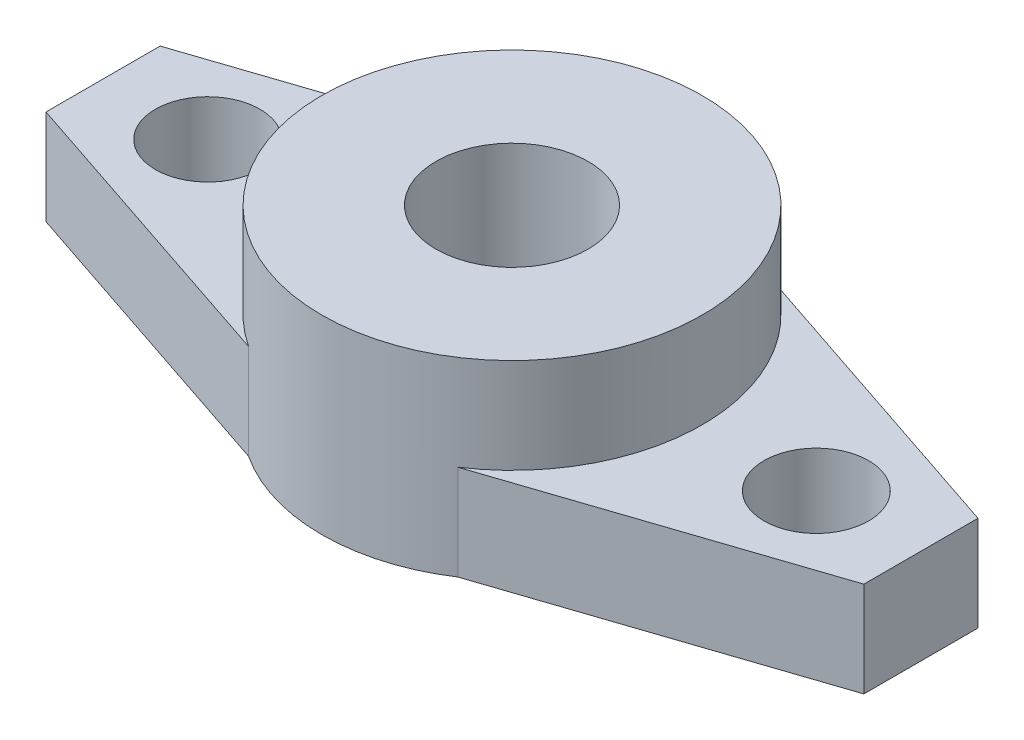
ISO-10303-21;
HEADER;
FILE_DESCRIPTION(('STEP AP214'),'2;1');
FILE_NAME('part.step','',(''),(''),'','','');
FILE_SCHEMA(('AUTOMOTIVE_DESIGN { 1 0 10303 214 1 1 1 1 }'));
ENDSEC;
DATA;
#1=APPLICATION_CONTEXT('core data for automotive mechanical design processes');
#2=APPLICATION_PROTOCOL_DEFINITION('international standard','automotive_design',2000,#1);
#3=PRODUCT_CONTEXT('',#1,'mechanical');
#4=PRODUCT('Part','Part','',(#3));
#5=PRODUCT_RELATED_PRODUCT_CATEGORY('part','',(#4));
#6=PRODUCT_DEFINITION_FORMATION('','',#4);
#7=PRODUCT_DEFINITION_CONTEXT('part definition',#1,'design');
#8=PRODUCT_DEFINITION('design','',#6,#7);
#9=PRODUCT_DEFINITION_SHAPE('','',#8);
#10=(LENGTH_UNIT() NAMED_UNIT(*) SI_UNIT(.MILLI.,.METRE.));
#11=(NAMED_UNIT(*) PLANE_ANGLE_UNIT() SI_UNIT($,.RADIAN.));
#12=(NAMED_UNIT(*) SI_UNIT($,.STERADIAN.) SOLID_ANGLE_UNIT());
#13=UNCERTAINTY_MEASURE_WITH_UNIT(LENGTH_MEASURE(1.E-05),#10,'distance_accuracy_value','');
#14=(GEOMETRIC_REPRESENTATION_CONTEXT(3) GLOBAL_UNCERTAINTY_ASSIGNED_CONTEXT((#13)) GLOBAL_UNIT_ASSIGNED_CONTEXT((#10,
#11,#12)) REPRESENTATION_CONTEXT('',''));
#15=CARTESIAN_POINT('',(0.,0.,0.));
#16=DIRECTION('',(0.,0.,1.));
#17=DIRECTION('',(1.,0.,0.));
#18=AXIS2_PLACEMENT_3D('',#15,#16,#17);
#19=CARTESIAN_POINT('',(3.0657717108335,5.,9.16584213247137));
#20=DIRECTION('',(0.317204518234438,0.,0.948357155090664));
#21=DIRECTION('',(0.948357155090664,0.,-0.317204518234438));
#22=AXIS2_PLACEMENT_3D('',#19,#20,#21);
#23=PLANE('',#22);
#24=DIRECTION('',(-0.948357155090664,0.,0.317204518234438));
#25=VECTOR('',#24,1.);
#26=CARTESIAN_POINT('',(3.0657717108335,0.,9.16584213247137));
#27=LINE('',#26,#25);
#28=CARTESIAN_POINT('',(21.5,0.,2.99999999999999));
#29=VERTEX_POINT('',#28);
#30=CARTESIAN_POINT('',(5.5,0.,8.35164654424503));
#31=VERTEX_POINT('',#30);
#32=EDGE_CURVE('E145',#29,#31,#27,.T.);
#33=ORIENTED_EDGE('',*,*,#32,.F.);
#34=DIRECTION('',(0.,-1.,0.));
#35=VECTOR('',#34,1.);
#36=CARTESIAN_POINT('',(21.5,5.,2.99999999999999));
#37=LINE('',#36,#35);
#38=CARTESIAN_POINT('',(21.5,5.,2.99999999999999));
#39=VERTEX_POINT('',#38);
#40=EDGE_CURVE('E42',#39,#29,#37,.T.);
#41=ORIENTED_EDGE('',*,*,#40,.F.);
#42=DIRECTION('',(-0.948357155090664,0.,0.317204518234438));
#43=VECTOR('',#42,1.);
#44=CARTESIAN_POINT('',(3.0657717108335,5.,9.16584213247137));
#45=LINE('',#44,#43);
#46=CARTESIAN_POINT('',(5.5,5.,8.35164654424503));
#47=VERTEX_POINT('',#46);
#48=EDGE_CURVE('E150',#39,#47,#45,.T.);
#49=ORIENTED_EDGE('',*,*,#48,.T.);
#50=DIRECTION('',(0.,-1.,0.));
#51=VECTOR('',#50,1.);
#52=CARTESIAN_POINT('',(5.5,5.,8.35164654424503));
#53=LINE('',#52,#51);
#54=EDGE_CURVE('E11',#47,#31,#53,.T.);
#55=ORIENTED_EDGE('',*,*,#54,.T.);
#56=EDGE_LOOP('',(#33,#41,#49,#55));
#57=FACE_BOUND('',#56,.T.);
#58=ADVANCED_FACE('F35',(#57),#23,.T.);
#59=CARTESIAN_POINT('',(21.5,5.,0.));
#60=DIRECTION('',(1.,0.,0.));
#61=DIRECTION('',(0.,0.,-1.));
#62=AXIS2_PLACEMENT_3D('',#59,#60,#61);
#63=PLANE('',#62);
#64=DIRECTION('',(0.,0.,1.));
#65=VECTOR('',#64,1.);
#66=CARTESIAN_POINT('',(21.5,0.,0.));
#67=LINE('',#66,#65);
#68=CARTESIAN_POINT('',(21.5,0.,-3.));
#69=VERTEX_POINT('',#68);
#70=EDGE_CURVE('E166',#69,#29,#67,.T.);
#71=ORIENTED_EDGE('',*,*,#70,.F.);
#72=DIRECTION('',(0.,-1.,0.));
#73=VECTOR('',#72,1.);
#74=CARTESIAN_POINT('',(21.5,5.,-3.));
#75=LINE('',#74,#73);
#76=CARTESIAN_POINT('',(21.5,5.,-3.));
#77=VERTEX_POINT('',#76);
#78=EDGE_CURVE('E176',#77,#69,#75,.T.);
#79=ORIENTED_EDGE('',*,*,#78,.F.);
#80=DIRECTION('',(0.,0.,1.));
#81=VECTOR('',#80,1.);
#82=CARTESIAN_POINT('',(21.5,5.,0.));
#83=LINE('',#82,#81);
#84=EDGE_CURVE('E154',#77,#39,#83,.T.);
#85=ORIENTED_EDGE('',*,*,#84,.T.);
#86=ORIENTED_EDGE('',*,*,#40,.T.);
#87=EDGE_LOOP('',(#71,#79,#85,#86));
#88=FACE_BOUND('',#87,.T.);
#89=ADVANCED_FACE('F180',(#88),#63,.T.);
#90=CARTESIAN_POINT('',(3.0657717108335,5.,-9.16584213247137));
#91=DIRECTION('',(-0.317204518234438,0.,0.948357155090664));
#92=DIRECTION('',(0.948357155090664,0.,0.317204518234438));
#93=AXIS2_PLACEMENT_3D('',#90,#91,#92);
#94=PLANE('',#93);
#95=DIRECTION('',(-0.948357155090664,0.,-0.317204518234438));
#96=VECTOR('',#95,1.);
#97=CARTESIAN_POINT('',(3.0657717108335,0.,-9.16584213247137));
#98=LINE('',#97,#96);
#99=CARTESIAN_POINT('',(5.5,0.,-8.35164654424504));
#100=VERTEX_POINT('',#99);
#101=EDGE_CURVE('E169',#69,#100,#98,.T.);
#102=ORIENTED_EDGE('',*,*,#101,.T.);
#103=DIRECTION('',(0.,-1.,0.));
#104=VECTOR('',#103,1.);
#105=CARTESIAN_POINT('',(5.5,5.,-8.35164654424504));
#106=LINE('',#105,#104);
#107=CARTESIAN_POINT('',(5.5,5.,-8.35164654424504));
#108=VERTEX_POINT('',#107);
#109=EDGE_CURVE('E163',#108,#100,#106,.T.);
#110=ORIENTED_EDGE('',*,*,#109,.F.);
#111=DIRECTION('',(-0.948357155090664,0.,-0.317204518234438));
#112=VECTOR('',#111,1.);
#113=CARTESIAN_POINT('',(3.0657717108335,5.,-9.16584213247137));
#114=LINE('',#113,#112);
#115=EDGE_CURVE('E157',#77,#108,#114,.T.);
#116=ORIENTED_EDGE('',*,*,#115,.F.);
#117=ORIENTED_EDGE('',*,*,#78,.T.);
#118=EDGE_LOOP('',(#102,#110,#116,#117));
#119=FACE_BOUND('',#118,.T.);
#120=ADVANCED_FACE('F190',(#119),#94,.F.);
#121=CARTESIAN_POINT('',(16.,5.,0.));
#122=DIRECTION('',(0.,-1.,0.));
#123=DIRECTION('',(0.,0.,-1.));
#124=AXIS2_PLACEMENT_3D('',#121,#122,#123);
#125=CYLINDRICAL_SURFACE('',#124,2.75);
#126=CARTESIAN_POINT('',(16.,5.,0.));
#127=DIRECTION('',(0.,1.,0.));
#128=DIRECTION('',(0.,0.,1.));
#129=AXIS2_PLACEMENT_3D('',#126,#127,#128);
#130=CIRCLE('',#129,2.75);
#131=CARTESIAN_POINT('',(16.,5.,2.74999999999999));
#132=VERTEX_POINT('',#131);
#133=EDGE_CURVE('E160',#132,#132,#130,.T.);
#134=ORIENTED_EDGE('',*,*,#133,.T.);
#135=EDGE_LOOP('',(#134));
#136=FACE_BOUND('',#135,.T.);
#137=CARTESIAN_POINT('',(16.,0.,0.));
#138=DIRECTION('',(0.,1.,0.));
#139=DIRECTION('',(0.,0.,1.));
#140=AXIS2_PLACEMENT_3D('',#137,#138,#139);
#141=CIRCLE('',#140,2.75);
#142=CARTESIAN_POINT('',(16.,0.,2.74999999999999));
#143=VERTEX_POINT('',#142);
#144=EDGE_CURVE('E151',#143,#143,#141,.T.);
#145=ORIENTED_EDGE('',*,*,#144,.F.);
#146=EDGE_LOOP('',(#145));
#147=FACE_BOUND('',#146,.T.);
#148=ADVANCED_FACE('F219',(#136,#147),#125,.F.);
#149=CARTESIAN_POINT('',(0.,5.,0.));
#150=DIRECTION('',(0.,1.,0.));
#151=DIRECTION('',(0.,0.,1.));
#152=AXIS2_PLACEMENT_3D('',#149,#150,#151);
#153=PLANE('',#152);
#154=CARTESIAN_POINT('',(0.,5.,0.));
#155=DIRECTION('',(0.,1.,0.));
#156=DIRECTION('',(0.,0.,1.));
#157=AXIS2_PLACEMENT_3D('',#154,#155,#156);
#158=CIRCLE('',#157,10.);
#159=EDGE_CURVE('E148',#47,#108,#158,.T.);
#160=ORIENTED_EDGE('',*,*,#159,.F.);
#161=ORIENTED_EDGE('',*,*,#48,.F.);
#162=ORIENTED_EDGE('',*,*,#84,.F.);
#163=ORIENTED_EDGE('',*,*,#115,.T.);
#164=EDGE_LOOP('',(#160,#161,#162,#163));
#165=FACE_BOUND('',#164,.T.);
#166=ORIENTED_EDGE('',*,*,#133,.F.);
#167=EDGE_LOOP('',(#166));
#168=FACE_BOUND('',#167,.T.);
#169=ADVANCED_FACE('F194',(#165,#168),#153,.T.);
#170=CARTESIAN_POINT('',(0.,0.,0.));
#171=DIRECTION('',(0.,1.,0.));
#172=DIRECTION('',(0.,0.,1.));
#173=AXIS2_PLACEMENT_3D('',#170,#171,#172);
#174=PLANE('',#173);
#175=CARTESIAN_POINT('',(0.,0.,0.));
#176=DIRECTION('',(0.,1.,0.));
#177=DIRECTION('',(0.,0.,1.));
#178=AXIS2_PLACEMENT_3D('',#175,#176,#177);
#179=CIRCLE('',#178,4.);
#180=CARTESIAN_POINT('',(0.,0.,4.));
#181=VERTEX_POINT('',#180);
#182=EDGE_CURVE('E131',#181,#181,#179,.T.);
#183=ORIENTED_EDGE('',*,*,#182,.T.);
#184=EDGE_LOOP('',(#183));
#185=FACE_BOUND('',#184,.T.);
#186=ORIENTED_EDGE('',*,*,#32,.T.);
#187=CARTESIAN_POINT('',(0.,0.,0.));
#188=DIRECTION('',(0.,1.,0.));
#189=DIRECTION('',(0.,0.,1.));
#190=AXIS2_PLACEMENT_3D('',#187,#188,#189);
#191=CIRCLE('',#190,10.);
#192=CARTESIAN_POINT('',(-5.5,0.,8.35164654424503));
#193=VERTEX_POINT('',#192);
#194=EDGE_CURVE('E141',#193,#31,#191,.T.);
#195=ORIENTED_EDGE('',*,*,#194,.F.);
#196=DIRECTION('',(0.948357155090664,0.,0.317204518234438));
#197=VECTOR('',#196,1.);
#198=CARTESIAN_POINT('',(-3.06577171083349,0.,9.16584213247137));
#199=LINE('',#198,#197);
#200=CARTESIAN_POINT('',(-21.5,0.,3.));
#201=VERTEX_POINT('',#200);
#202=EDGE_CURVE('E133',#201,#193,#199,.T.);
#203=ORIENTED_EDGE('',*,*,#202,.F.);
#204=DIRECTION('',(0.,0.,1.));
#205=VECTOR('',#204,1.);
#206=CARTESIAN_POINT('',(-21.5,0.,0.));
#207=LINE('',#206,#205);
#208=CARTESIAN_POINT('',(-21.5,0.,-3.));
#209=VERTEX_POINT('',#208);
#210=EDGE_CURVE('E130',#209,#201,#207,.T.);
#211=ORIENTED_EDGE('',*,*,#210,.F.);
#212=DIRECTION('',(0.948357155090664,0.,-0.317204518234438));
#213=VECTOR('',#212,1.);
#214=CARTESIAN_POINT('',(-3.0657717108335,0.,-9.16584213247137));
#215=LINE('',#214,#213);
#216=CARTESIAN_POINT('',(-5.5,0.,-8.35164654424504));
#217=VERTEX_POINT('',#216);
#218=EDGE_CURVE('E104',#209,#217,#215,.T.);
#219=ORIENTED_EDGE('',*,*,#218,.T.);
#220=EDGE_CURVE('E146',#100,#217,#191,.T.);
#221=ORIENTED_EDGE('',*,*,#220,.F.);
#222=ORIENTED_EDGE('',*,*,#101,.F.);
#223=ORIENTED_EDGE('',*,*,#70,.T.);
#224=EDGE_LOOP('',(#186,#195,#203,#211,#219,#221,#222,#223));
#225=FACE_BOUND('',#224,.T.);
#226=ORIENTED_EDGE('',*,*,#144,.T.);
#227=EDGE_LOOP('',(#226));
#228=FACE_BOUND('',#227,.T.);
#229=CARTESIAN_POINT('',(-16.,0.,0.));
#230=DIRECTION('',(0.,1.,0.));
#231=DIRECTION('',(0.,0.,1.));
#232=AXIS2_PLACEMENT_3D('',#229,#230,#231);
#233=CIRCLE('',#232,2.75);
#234=CARTESIAN_POINT('',(-16.,0.,2.75));
#235=VERTEX_POINT('',#234);
#236=EDGE_CURVE('E120',#235,#235,#233,.T.);
#237=ORIENTED_EDGE('',*,*,#236,.T.);
#238=EDGE_LOOP('',(#237));
#239=FACE_BOUND('',#238,.T.);
#240=ADVANCED_FACE('F186',(#185,#225,#228,#239),#174,.F.);
#241=CARTESIAN_POINT('',(0.,10.,0.));
#242=DIRECTION('',(0.,-1.,0.));
#243=DIRECTION('',(0.,0.,-1.));
#244=AXIS2_PLACEMENT_3D('',#241,#242,#243);
#245=CYLINDRICAL_SURFACE('',#244,10.);
#246=ORIENTED_EDGE('',*,*,#220,.T.);
#247=DIRECTION('',(0.,-1.,0.));
#248=VECTOR('',#247,1.);
#249=CARTESIAN_POINT('',(-5.5,5.,-8.35164654424504));
#250=LINE('',#249,#248);
#251=CARTESIAN_POINT('',(-5.5,5.,-8.35164654424504));
#252=VERTEX_POINT('',#251);
#253=EDGE_CURVE('E54',#252,#217,#250,.T.);
#254=ORIENTED_EDGE('',*,*,#253,.F.);
#255=CARTESIAN_POINT('',(0.,5.,0.));
#256=DIRECTION('',(0.,1.,0.));
#257=DIRECTION('',(0.,0.,1.));
#258=AXIS2_PLACEMENT_3D('',#255,#256,#257);
#259=CIRCLE('',#258,10.);
#260=CARTESIAN_POINT('',(-5.5,5.,8.35164654424503));
#261=VERTEX_POINT('',#260);
#262=EDGE_CURVE('E49',#252,#261,#259,.T.);
#263=ORIENTED_EDGE('',*,*,#262,.T.);
#264=DIRECTION('',(0.,-1.,0.));
#265=VECTOR('',#264,1.);
#266=CARTESIAN_POINT('',(-5.5,5.,8.35164654424503));
#267=LINE('',#266,#265);
#268=EDGE_CURVE('E128',#261,#193,#267,.T.);
#269=ORIENTED_EDGE('',*,*,#268,.T.);
#270=ORIENTED_EDGE('',*,*,#194,.T.);
#271=ORIENTED_EDGE('',*,*,#54,.F.);
#272=ORIENTED_EDGE('',*,*,#159,.T.);
#273=ORIENTED_EDGE('',*,*,#109,.T.);
#274=EDGE_LOOP('',(#246,#254,#263,#269,#270,#271,#272,#273));
#275=FACE_BOUND('',#274,.T.);
#276=CARTESIAN_POINT('',(0.,10.,0.));
#277=DIRECTION('',(0.,1.,0.));
#278=DIRECTION('',(0.,0.,1.));
#279=AXIS2_PLACEMENT_3D('',#276,#277,#278);
#280=CIRCLE('',#279,10.);
#281=CARTESIAN_POINT('',(0.,10.,10.));
#282=VERTEX_POINT('',#281);
#283=EDGE_CURVE('E142',#282,#282,#280,.T.);
#284=ORIENTED_EDGE('',*,*,#283,.F.);
#285=EDGE_LOOP('',(#284));
#286=FACE_BOUND('',#285,.T.);
#287=ADVANCED_FACE('F196',(#275,#286),#245,.T.);
#288=CARTESIAN_POINT('',(0.,10.,0.));
#289=DIRECTION('',(0.,1.,0.));
#290=DIRECTION('',(0.,0.,1.));
#291=AXIS2_PLACEMENT_3D('',#288,#289,#290);
#292=PLANE('',#291);
#293=CARTESIAN_POINT('',(0.,10.,0.));
#294=DIRECTION('',(0.,1.,0.));
#295=DIRECTION('',(0.,0.,1.));
#296=AXIS2_PLACEMENT_3D('',#293,#294,#295);
#297=CIRCLE('',#296,4.);
#298=CARTESIAN_POINT('',(0.,10.,4.));
#299=VERTEX_POINT('',#298);
#300=EDGE_CURVE('E295',#299,#299,#297,.T.);
#301=ORIENTED_EDGE('',*,*,#300,.F.);
#302=EDGE_LOOP('',(#301));
#303=FACE_BOUND('',#302,.T.);
#304=ORIENTED_EDGE('',*,*,#283,.T.);
#305=EDGE_LOOP('',(#304));
#306=FACE_BOUND('',#305,.T.);
#307=ADVANCED_FACE('F232',(#303,#306),#292,.T.);
#308=CARTESIAN_POINT('',(-3.0657717108335,5.,-9.16584213247137));
#309=DIRECTION('',(-0.317204518234438,0.,-0.948357155090664));
#310=DIRECTION('',(-0.948357155090664,0.,0.317204518234438));
#311=AXIS2_PLACEMENT_3D('',#308,#309,#310);
#312=PLANE('',#311);
#313=ORIENTED_EDGE('',*,*,#218,.F.);
#314=DIRECTION('',(0.,-1.,0.));
#315=VECTOR('',#314,1.);
#316=CARTESIAN_POINT('',(-21.5,5.,-3.));
#317=LINE('',#316,#315);
#318=CARTESIAN_POINT('',(-21.5,5.,-3.));
#319=VERTEX_POINT('',#318);
#320=EDGE_CURVE('E98',#319,#209,#317,.T.);
#321=ORIENTED_EDGE('',*,*,#320,.F.);
#322=DIRECTION('',(0.948357155090664,0.,-0.317204518234438));
#323=VECTOR('',#322,1.);
#324=CARTESIAN_POINT('',(-3.0657717108335,5.,-9.16584213247137));
#325=LINE('',#324,#323);
#326=EDGE_CURVE('E102',#319,#252,#325,.T.);
#327=ORIENTED_EDGE('',*,*,#326,.T.);
#328=ORIENTED_EDGE('',*,*,#253,.T.);
#329=EDGE_LOOP('',(#313,#321,#327,#328));
#330=FACE_BOUND('',#329,.T.);
#331=ADVANCED_FACE('F100',(#330),#312,.T.);
#332=CARTESIAN_POINT('',(-21.5,5.,0.));
#333=DIRECTION('',(1.,0.,0.));
#334=DIRECTION('',(0.,0.,-1.));
#335=AXIS2_PLACEMENT_3D('',#332,#333,#334);
#336=PLANE('',#335);
#337=ORIENTED_EDGE('',*,*,#210,.T.);
#338=DIRECTION('',(0.,-1.,0.));
#339=VECTOR('',#338,1.);
#340=CARTESIAN_POINT('',(-21.5,5.,3.));
#341=LINE('',#340,#339);
#342=CARTESIAN_POINT('',(-21.5,5.,3.));
#343=VERTEX_POINT('',#342);
#344=EDGE_CURVE('E107',#343,#201,#341,.T.);
#345=ORIENTED_EDGE('',*,*,#344,.F.);
#346=DIRECTION('',(0.,0.,1.));
#347=VECTOR('',#346,1.);
#348=CARTESIAN_POINT('',(-21.5,5.,0.));
#349=LINE('',#348,#347);
#350=EDGE_CURVE('E110',#319,#343,#349,.T.);
#351=ORIENTED_EDGE('',*,*,#350,.F.);
#352=ORIENTED_EDGE('',*,*,#320,.T.);
#353=EDGE_LOOP('',(#337,#345,#351,#352));
#354=FACE_BOUND('',#353,.T.);
#355=ADVANCED_FACE('F111',(#354),#336,.F.);
#356=CARTESIAN_POINT('',(-3.06577171083349,5.,9.16584213247137));
#357=DIRECTION('',(0.317204518234438,0.,-0.948357155090664));
#358=DIRECTION('',(-0.948357155090664,0.,-0.317204518234438));
#359=AXIS2_PLACEMENT_3D('',#356,#357,#358);
#360=PLANE('',#359);
#361=ORIENTED_EDGE('',*,*,#202,.T.);
#362=ORIENTED_EDGE('',*,*,#268,.F.);
#363=DIRECTION('',(0.948357155090664,0.,0.317204518234438));
#364=VECTOR('',#363,1.);
#365=CARTESIAN_POINT('',(-3.06577171083349,5.,9.16584213247137));
#366=LINE('',#365,#364);
#367=EDGE_CURVE('E115',#343,#261,#366,.T.);
#368=ORIENTED_EDGE('',*,*,#367,.F.);
#369=ORIENTED_EDGE('',*,*,#344,.T.);
#370=EDGE_LOOP('',(#361,#362,#368,#369));
#371=FACE_BOUND('',#370,.T.);
#372=ADVANCED_FACE('F201',(#371),#360,.F.);
#373=CARTESIAN_POINT('',(-16.,5.,0.));
#374=DIRECTION('',(0.,-1.,0.));
#375=DIRECTION('',(0.,0.,-1.));
#376=AXIS2_PLACEMENT_3D('',#373,#374,#375);
#377=CYLINDRICAL_SURFACE('',#376,2.75);
#378=CARTESIAN_POINT('',(-16.,5.,0.));
#379=DIRECTION('',(0.,1.,0.));
#380=DIRECTION('',(0.,0.,1.));
#381=AXIS2_PLACEMENT_3D('',#378,#379,#380);
#382=CIRCLE('',#381,2.75);
#383=CARTESIAN_POINT('',(-16.,5.,2.75));
#384=VERTEX_POINT('',#383);
#385=EDGE_CURVE('E125',#384,#384,#382,.T.);
#386=ORIENTED_EDGE('',*,*,#385,.T.);
#387=EDGE_LOOP('',(#386));
#388=FACE_BOUND('',#387,.T.);
#389=ORIENTED_EDGE('',*,*,#236,.F.);
#390=EDGE_LOOP('',(#389));
#391=FACE_BOUND('',#390,.T.);
#392=ADVANCED_FACE('F203',(#388,#391),#377,.F.);
#393=CARTESIAN_POINT('',(0.,5.,0.));
#394=DIRECTION('',(0.,1.,0.));
#395=DIRECTION('',(0.,0.,1.));
#396=AXIS2_PLACEMENT_3D('',#393,#394,#395);
#397=PLANE('',#396);
#398=ORIENTED_EDGE('',*,*,#262,.F.);
#399=ORIENTED_EDGE('',*,*,#326,.F.);
#400=ORIENTED_EDGE('',*,*,#350,.T.);
#401=ORIENTED_EDGE('',*,*,#367,.T.);
#402=EDGE_LOOP('',(#398,#399,#400,#401));
#403=FACE_BOUND('',#402,.T.);
#404=ORIENTED_EDGE('',*,*,#385,.F.);
#405=EDGE_LOOP('',(#404));
#406=FACE_BOUND('',#405,.T.);
#407=ADVANCED_FACE('F117',(#403,#406),#397,.T.);
#408=CARTESIAN_POINT('',(0.,0.,0.));
#409=DIRECTION('',(0.,1.,0.));
#410=DIRECTION('',(0.,0.,1.));
#411=AXIS2_PLACEMENT_3D('',#408,#409,#410);
#412=CYLINDRICAL_SURFACE('',#411,4.);
#413=ORIENTED_EDGE('',*,*,#182,.F.);
#414=EDGE_LOOP('',(#413));
#415=FACE_BOUND('',#414,.T.);
#416=ORIENTED_EDGE('',*,*,#300,.T.);
#417=EDGE_LOOP('',(#416));
#418=FACE_BOUND('',#417,.T.);
#419=ADVANCED_FACE('F265',(#415,#418),#412,.F.);
#420=CLOSED_SHELL('',(#58,#89,#120,#148,#169,#240,#287,#307,#331,#355,#372,#392,#407,#419));
#421=MANIFOLD_SOLID_BREP('B2',#420);
#422=ADVANCED_BREP_SHAPE_REPRESENTATION('',(#18,#421),#14);
#423=SHAPE_DEFINITION_REPRESENTATION(#9,#422);
ENDSEC;
END-ISO-10303-21;
